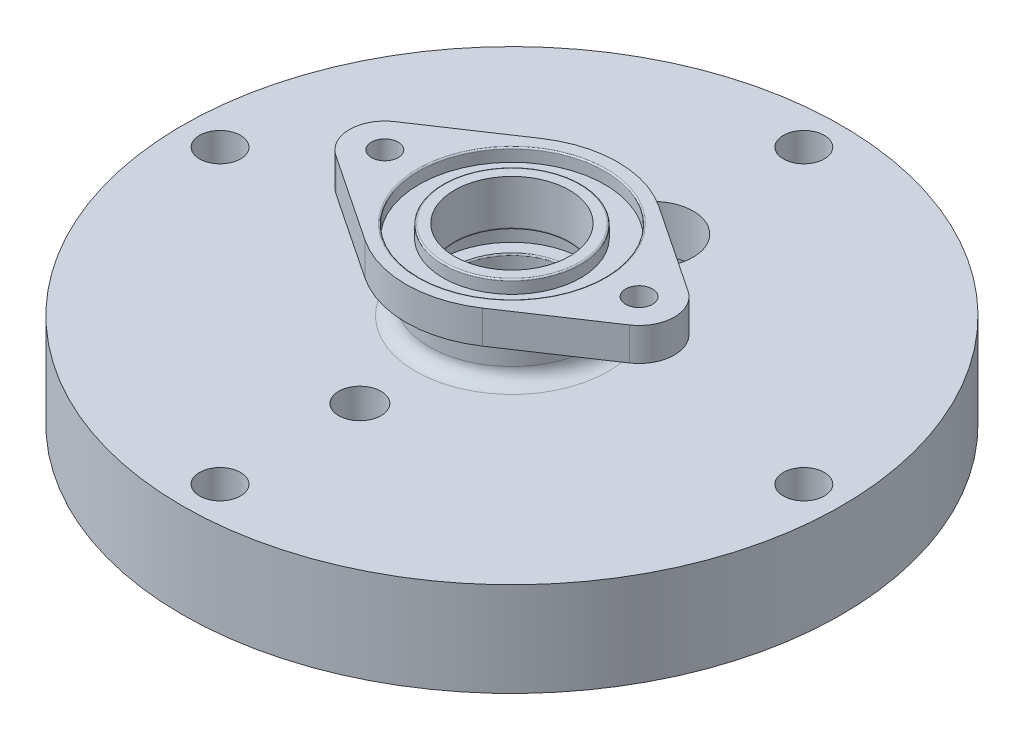
ISO-10303-21;
HEADER;
FILE_DESCRIPTION(('STEP AP214'),'2;1');
FILE_NAME('part.step','',(''),(''),'','','');
FILE_SCHEMA(('AUTOMOTIVE_DESIGN { 1 0 10303 214 1 1 1 1 }'));
ENDSEC;
DATA;
#1=APPLICATION_CONTEXT('core data for automotive mechanical design processes');
#2=APPLICATION_PROTOCOL_DEFINITION('international standard','automotive_design',2000,#1);
#3=PRODUCT_CONTEXT('',#1,'mechanical');
#4=PRODUCT('Part','Part','',(#3));
#5=PRODUCT_RELATED_PRODUCT_CATEGORY('part','',(#4));
#6=PRODUCT_DEFINITION_FORMATION('','',#4);
#7=PRODUCT_DEFINITION_CONTEXT('part definition',#1,'design');
#8=PRODUCT_DEFINITION('design','',#6,#7);
#9=PRODUCT_DEFINITION_SHAPE('','',#8);
#10=(LENGTH_UNIT() NAMED_UNIT(*) SI_UNIT(.MILLI.,.METRE.));
#11=(NAMED_UNIT(*) PLANE_ANGLE_UNIT() SI_UNIT($,.RADIAN.));
#12=(NAMED_UNIT(*) SI_UNIT($,.STERADIAN.) SOLID_ANGLE_UNIT());
#13=UNCERTAINTY_MEASURE_WITH_UNIT(LENGTH_MEASURE(1.E-05),#10,'distance_accuracy_value','');
#14=(GEOMETRIC_REPRESENTATION_CONTEXT(3) GLOBAL_UNCERTAINTY_ASSIGNED_CONTEXT((#13)) GLOBAL_UNIT_ASSIGNED_CONTEXT((#10,
#11,#12)) REPRESENTATION_CONTEXT('',''));
#15=CARTESIAN_POINT('',(0.,0.,0.));
#16=DIRECTION('',(0.,0.,1.));
#17=DIRECTION('',(1.,0.,0.));
#18=AXIS2_PLACEMENT_3D('',#15,#16,#17);
#19=CARTESIAN_POINT('',(0.,0.,0.));
#20=DIRECTION('',(0.,1.,0.));
#21=DIRECTION('',(0.,0.,1.));
#22=AXIS2_PLACEMENT_3D('',#19,#20,#21);
#23=PLANE('',#22);
#24=CARTESIAN_POINT('',(0.,0.,0.));
#25=DIRECTION('',(0.,-1.,0.));
#26=DIRECTION('',(0.,0.,-1.));
#27=AXIS2_PLACEMENT_3D('',#24,#25,#26);
#28=CIRCLE('',#27,41.);
#29=CARTESIAN_POINT('',(0.,0.,-41.));
#30=VERTEX_POINT('',#29);
#31=EDGE_CURVE('E180',#30,#30,#28,.T.);
#32=ORIENTED_EDGE('',*,*,#31,.F.);
#33=EDGE_LOOP('',(#32));
#34=FACE_BOUND('',#33,.T.);
#35=CARTESIAN_POINT('',(0.,0.,0.));
#36=DIRECTION('',(0.,-1.,0.));
#37=DIRECTION('',(0.,0.,-1.));
#38=AXIS2_PLACEMENT_3D('',#35,#36,#37);
#39=CIRCLE('',#38,44.25);
#40=CARTESIAN_POINT('',(0.,0.,-44.25));
#41=VERTEX_POINT('',#40);
#42=EDGE_CURVE('E760',#41,#41,#39,.T.);
#43=ORIENTED_EDGE('',*,*,#42,.T.);
#44=EDGE_LOOP('',(#43));
#45=FACE_BOUND('',#44,.T.);
#46=ADVANCED_FACE('F45',(#34,#45),#23,.F.);
#47=CARTESIAN_POINT('',(0.,0.,0.));
#48=DIRECTION('',(0.,1.,0.));
#49=DIRECTION('',(0.,0.,1.));
#50=AXIS2_PLACEMENT_3D('',#47,#48,#49);
#51=CYLINDRICAL_SURFACE('',#50,12.2);
#52=CARTESIAN_POINT('',(0.,27.5318590738035,0.));
#53=DIRECTION('',(0.,1.,0.));
#54=DIRECTION('',(0.,0.,1.));
#55=AXIS2_PLACEMENT_3D('',#52,#53,#54);
#56=CIRCLE('',#55,12.2);
#57=CARTESIAN_POINT('',(0.,27.5318590738035,12.2));
#58=VERTEX_POINT('',#57);
#59=EDGE_CURVE('E54',#58,#58,#56,.F.);
#60=ORIENTED_EDGE('',*,*,#59,.T.);
#61=EDGE_LOOP('',(#60));
#62=FACE_BOUND('',#61,.T.);
#63=CARTESIAN_POINT('',(0.,37.,0.));
#64=DIRECTION('',(0.,1.,0.));
#65=DIRECTION('',(0.,0.,1.));
#66=AXIS2_PLACEMENT_3D('',#63,#64,#65);
#67=CIRCLE('',#66,12.2);
#68=CARTESIAN_POINT('',(0.,37.,12.2));
#69=VERTEX_POINT('',#68);
#70=EDGE_CURVE('E399',#69,#69,#67,.T.);
#71=ORIENTED_EDGE('',*,*,#70,.T.);
#72=EDGE_LOOP('',(#71));
#73=FACE_BOUND('',#72,.T.);
#74=ADVANCED_FACE('F224',(#62,#73),#51,.F.);
#75=CARTESIAN_POINT('',(-27.,37.,0.));
#76=DIRECTION('',(0.,1.,0.));
#77=DIRECTION('',(0.,0.,1.));
#78=AXIS2_PLACEMENT_3D('',#75,#76,#77);
#79=PLANE('',#78);
#80=CARTESIAN_POINT('',(0.,37.,0.));
#81=DIRECTION('',(0.,1.,0.));
#82=DIRECTION('',(0.,0.,1.));
#83=AXIS2_PLACEMENT_3D('',#80,#81,#82);
#84=CIRCLE('',#83,14.32);
#85=CARTESIAN_POINT('',(0.,37.,14.32));
#86=VERTEX_POINT('',#85);
#87=EDGE_CURVE('E198',#86,#86,#84,.T.);
#88=ORIENTED_EDGE('',*,*,#87,.T.);
#89=EDGE_LOOP('',(#88));
#90=FACE_BOUND('',#89,.T.);
#91=ORIENTED_EDGE('',*,*,#70,.F.);
#92=EDGE_LOOP('',(#91));
#93=FACE_BOUND('',#92,.T.);
#94=ADVANCED_FACE('F246',(#90,#93),#79,.T.);
#95=CARTESIAN_POINT('',(0.,20.,0.));
#96=DIRECTION('',(0.,-1.,0.));
#97=DIRECTION('',(0.,0.,-1.));
#98=AXIS2_PLACEMENT_3D('',#95,#96,#97);
#99=CYLINDRICAL_SURFACE('',#98,70.);
#100=CARTESIAN_POINT('',(0.,20.,0.));
#101=DIRECTION('',(0.,1.,0.));
#102=DIRECTION('',(0.,0.,1.));
#103=AXIS2_PLACEMENT_3D('',#100,#101,#102);
#104=CIRCLE('',#103,70.);
#105=CARTESIAN_POINT('',(0.,20.,70.));
#106=VERTEX_POINT('',#105);
#107=EDGE_CURVE('E187',#106,#106,#104,.T.);
#108=ORIENTED_EDGE('',*,*,#107,.F.);
#109=EDGE_LOOP('',(#108));
#110=FACE_BOUND('',#109,.T.);
#111=CARTESIAN_POINT('',(0.,0.,0.));
#112=DIRECTION('',(0.,1.,0.));
#113=DIRECTION('',(0.,0.,1.));
#114=AXIS2_PLACEMENT_3D('',#111,#112,#113);
#115=CIRCLE('',#114,70.);
#116=CARTESIAN_POINT('',(0.,0.,70.));
#117=VERTEX_POINT('',#116);
#118=EDGE_CURVE('E184',#117,#117,#115,.T.);
#119=ORIENTED_EDGE('',*,*,#118,.T.);
#120=EDGE_LOOP('',(#119));
#121=FACE_BOUND('',#120,.T.);
#122=ADVANCED_FACE('F268',(#110,#121),#99,.T.);
#123=CARTESIAN_POINT('',(0.,20.,0.));
#124=DIRECTION('',(0.,1.,0.));
#125=DIRECTION('',(0.,0.,1.));
#126=AXIS2_PLACEMENT_3D('',#123,#124,#125);
#127=PLANE('',#126);
#128=CARTESIAN_POINT('',(0.,20.,32.2985888887792));
#129=DIRECTION('',(0.,-1.,0.));
#130=DIRECTION('',(0.,0.,-1.));
#131=AXIS2_PLACEMENT_3D('',#128,#129,#130);
#132=CIRCLE('',#131,4.49999999999999);
#133=CARTESIAN_POINT('',(0.,20.,27.7985888887792));
#134=VERTEX_POINT('',#133);
#135=EDGE_CURVE('E369',#134,#134,#132,.T.);
#136=ORIENTED_EDGE('',*,*,#135,.T.);
#137=EDGE_LOOP('',(#136));
#138=FACE_BOUND('',#137,.T.);
#139=CARTESIAN_POINT('',(0.,20.,-30.));
#140=DIRECTION('',(0.,1.,0.));
#141=DIRECTION('',(0.,0.,1.));
#142=AXIS2_PLACEMENT_3D('',#139,#140,#141);
#143=CIRCLE('',#142,8.5);
#144=CARTESIAN_POINT('',(0.,20.,-21.5));
#145=VERTEX_POINT('',#144);
#146=EDGE_CURVE('E364',#145,#145,#143,.T.);
#147=ORIENTED_EDGE('',*,*,#146,.F.);
#148=EDGE_LOOP('',(#147));
#149=FACE_BOUND('',#148,.T.);
#150=CARTESIAN_POINT('',(0.,20.,-62.));
#151=DIRECTION('',(0.,1.,0.));
#152=DIRECTION('',(0.,0.,1.));
#153=AXIS2_PLACEMENT_3D('',#150,#151,#152);
#154=CIRCLE('',#153,4.35);
#155=CARTESIAN_POINT('',(0.,20.,-57.65));
#156=VERTEX_POINT('',#155);
#157=EDGE_CURVE('E376',#156,#156,#154,.T.);
#158=ORIENTED_EDGE('',*,*,#157,.F.);
#159=EDGE_LOOP('',(#158));
#160=FACE_BOUND('',#159,.T.);
#161=CARTESIAN_POINT('',(62.0000000000018,20.,-1.75455317453033E-12));
#162=DIRECTION('',(0.,1.,0.));
#163=DIRECTION('',(0.,0.,1.));
#164=AXIS2_PLACEMENT_3D('',#161,#162,#163);
#165=CIRCLE('',#164,4.34999999999999);
#166=CARTESIAN_POINT('',(62.0000000000018,20.,4.34999999999824));
#167=VERTEX_POINT('',#166);
#168=EDGE_CURVE('E380',#167,#167,#165,.T.);
#169=ORIENTED_EDGE('',*,*,#168,.F.);
#170=EDGE_LOOP('',(#169));
#171=FACE_BOUND('',#170,.T.);
#172=CARTESIAN_POINT('',(3.50910634906067E-12,20.,62.));
#173=DIRECTION('',(0.,1.,0.));
#174=DIRECTION('',(0.,0.,1.));
#175=AXIS2_PLACEMENT_3D('',#172,#173,#174);
#176=CIRCLE('',#175,4.35);
#177=CARTESIAN_POINT('',(3.50910634906067E-12,20.,66.35));
#178=VERTEX_POINT('',#177);
#179=EDGE_CURVE('E384',#178,#178,#176,.T.);
#180=ORIENTED_EDGE('',*,*,#179,.F.);
#181=EDGE_LOOP('',(#180));
#182=FACE_BOUND('',#181,.T.);
#183=CARTESIAN_POINT('',(-61.9999999999983,20.,1.76214598468505E-12));
#184=DIRECTION('',(0.,1.,0.));
#185=DIRECTION('',(0.,0.,1.));
#186=AXIS2_PLACEMENT_3D('',#183,#184,#185);
#187=CIRCLE('',#186,4.35);
#188=CARTESIAN_POINT('',(-61.9999999999983,20.,4.35000000000176));
#189=VERTEX_POINT('',#188);
#190=EDGE_CURVE('E363',#189,#189,#187,.T.);
#191=ORIENTED_EDGE('',*,*,#190,.F.);
#192=EDGE_LOOP('',(#191));
#193=FACE_BOUND('',#192,.T.);
#194=CARTESIAN_POINT('',(0.,20.,0.));
#195=DIRECTION('',(0.,1.,0.));
#196=DIRECTION('',(0.,0.,1.));
#197=AXIS2_PLACEMENT_3D('',#194,#195,#196);
#198=CIRCLE('',#197,20.5);
#199=CARTESIAN_POINT('',(0.,20.,20.5));
#200=VERTEX_POINT('',#199);
#201=EDGE_CURVE('E213',#200,#200,#198,.F.);
#202=ORIENTED_EDGE('',*,*,#201,.T.);
#203=EDGE_LOOP('',(#202));
#204=FACE_BOUND('',#203,.T.);
#205=ORIENTED_EDGE('',*,*,#107,.T.);
#206=EDGE_LOOP('',(#205));
#207=FACE_BOUND('',#206,.T.);
#208=ADVANCED_FACE('F258',(#138,#149,#160,#171,#182,#193,#204,#207),#127,.T.);
#209=CARTESIAN_POINT('',(0.,0.,0.));
#210=DIRECTION('',(0.,-1.,0.));
#211=DIRECTION('',(0.,0.,-1.));
#212=AXIS2_PLACEMENT_3D('',#209,#210,#211);
#213=CIRCLE('',#212,51.);
#214=CARTESIAN_POINT('',(0.,0.,-51.));
#215=VERTEX_POINT('',#214);
#216=EDGE_CURVE('E273',#215,#215,#213,.T.);
#217=ORIENTED_EDGE('',*,*,#216,.F.);
#218=EDGE_LOOP('',(#217));
#219=FACE_BOUND('',#218,.T.);
#220=CARTESIAN_POINT('',(0.,0.,-62.));
#221=DIRECTION('',(0.,1.,0.));
#222=DIRECTION('',(0.,0.,1.));
#223=AXIS2_PLACEMENT_3D('',#220,#221,#222);
#224=CIRCLE('',#223,4.35);
#225=CARTESIAN_POINT('',(0.,0.,-57.65));
#226=VERTEX_POINT('',#225);
#227=EDGE_CURVE('E277',#226,#226,#224,.T.);
#228=ORIENTED_EDGE('',*,*,#227,.T.);
#229=EDGE_LOOP('',(#228));
#230=FACE_BOUND('',#229,.T.);
#231=CARTESIAN_POINT('',(62.0000000000018,0.,-1.75455317453033E-12));
#232=DIRECTION('',(0.,1.,0.));
#233=DIRECTION('',(0.,0.,1.));
#234=AXIS2_PLACEMENT_3D('',#231,#232,#233);
#235=CIRCLE('',#234,4.34999999999999);
#236=CARTESIAN_POINT('',(62.0000000000018,0.,4.34999999999824));
#237=VERTEX_POINT('',#236);
#238=EDGE_CURVE('E281',#237,#237,#235,.T.);
#239=ORIENTED_EDGE('',*,*,#238,.T.);
#240=EDGE_LOOP('',(#239));
#241=FACE_BOUND('',#240,.T.);
#242=CARTESIAN_POINT('',(3.50910634906067E-12,0.,62.));
#243=DIRECTION('',(0.,1.,0.));
#244=DIRECTION('',(0.,0.,1.));
#245=AXIS2_PLACEMENT_3D('',#242,#243,#244);
#246=CIRCLE('',#245,4.35);
#247=CARTESIAN_POINT('',(3.50910634906067E-12,0.,66.35));
#248=VERTEX_POINT('',#247);
#249=EDGE_CURVE('E285',#248,#248,#246,.T.);
#250=ORIENTED_EDGE('',*,*,#249,.T.);
#251=EDGE_LOOP('',(#250));
#252=FACE_BOUND('',#251,.T.);
#253=CARTESIAN_POINT('',(-61.9999999999983,0.,1.76214598468505E-12));
#254=DIRECTION('',(0.,1.,0.));
#255=DIRECTION('',(0.,0.,1.));
#256=AXIS2_PLACEMENT_3D('',#253,#254,#255);
#257=CIRCLE('',#256,4.35);
#258=CARTESIAN_POINT('',(-61.9999999999983,0.,4.35000000000176));
#259=VERTEX_POINT('',#258);
#260=EDGE_CURVE('E289',#259,#259,#257,.T.);
#261=ORIENTED_EDGE('',*,*,#260,.T.);
#262=EDGE_LOOP('',(#261));
#263=FACE_BOUND('',#262,.T.);
#264=ORIENTED_EDGE('',*,*,#118,.F.);
#265=EDGE_LOOP('',(#264));
#266=FACE_BOUND('',#265,.T.);
#267=ADVANCED_FACE('F240',(#219,#230,#241,#252,#263,#266),#23,.F.);
#268=CARTESIAN_POINT('',(0.,10.,0.));
#269=DIRECTION('',(0.,-1.,0.));
#270=DIRECTION('',(0.,0.,-1.));
#271=AXIS2_PLACEMENT_3D('',#268,#269,#270);
#272=CYLINDRICAL_SURFACE('',#271,41.);
#273=CARTESIAN_POINT('',(0.,10.,0.));
#274=DIRECTION('',(0.,-1.,0.));
#275=DIRECTION('',(0.,0.,-1.));
#276=AXIS2_PLACEMENT_3D('',#273,#274,#275);
#277=CIRCLE('',#276,41.);
#278=CARTESIAN_POINT('',(0.,10.,-41.));
#279=VERTEX_POINT('',#278);
#280=EDGE_CURVE('E181',#279,#279,#277,.T.);
#281=ORIENTED_EDGE('',*,*,#280,.F.);
#282=EDGE_LOOP('',(#281));
#283=FACE_BOUND('',#282,.T.);
#284=ORIENTED_EDGE('',*,*,#31,.T.);
#285=EDGE_LOOP('',(#284));
#286=FACE_BOUND('',#285,.T.);
#287=ADVANCED_FACE('F257',(#283,#286),#272,.F.);
#288=CARTESIAN_POINT('',(0.,10.,0.));
#289=DIRECTION('',(0.,-1.,0.));
#290=DIRECTION('',(0.,0.,-1.));
#291=AXIS2_PLACEMENT_3D('',#288,#289,#290);
#292=PLANE('',#291);
#293=CARTESIAN_POINT('',(0.,10.,32.2985888887792));
#294=DIRECTION('',(0.,-1.,0.));
#295=DIRECTION('',(0.,0.,-1.));
#296=AXIS2_PLACEMENT_3D('',#293,#294,#295);
#297=CIRCLE('',#296,4.49999999999999);
#298=CARTESIAN_POINT('',(0.,10.,27.7985888887792));
#299=VERTEX_POINT('',#298);
#300=EDGE_CURVE('E352',#299,#299,#297,.T.);
#301=ORIENTED_EDGE('',*,*,#300,.F.);
#302=EDGE_LOOP('',(#301));
#303=FACE_BOUND('',#302,.T.);
#304=CARTESIAN_POINT('',(0.,10.,-30.));
#305=DIRECTION('',(0.,1.,0.));
#306=DIRECTION('',(0.,0.,1.));
#307=AXIS2_PLACEMENT_3D('',#304,#305,#306);
#308=CIRCLE('',#307,8.5);
#309=CARTESIAN_POINT('',(0.,10.,-21.5));
#310=VERTEX_POINT('',#309);
#311=EDGE_CURVE('E356',#310,#310,#308,.T.);
#312=ORIENTED_EDGE('',*,*,#311,.T.);
#313=EDGE_LOOP('',(#312));
#314=FACE_BOUND('',#313,.T.);
#315=CARTESIAN_POINT('',(0.,10.,0.));
#316=DIRECTION('',(0.,-1.,0.));
#317=DIRECTION('',(0.,0.,-1.));
#318=AXIS2_PLACEMENT_3D('',#315,#316,#317);
#319=CIRCLE('',#318,17.35);
#320=CARTESIAN_POINT('',(0.,10.,-17.35));
#321=VERTEX_POINT('',#320);
#322=EDGE_CURVE('E174',#321,#321,#319,.T.);
#323=ORIENTED_EDGE('',*,*,#322,.F.);
#324=EDGE_LOOP('',(#323));
#325=FACE_BOUND('',#324,.T.);
#326=ORIENTED_EDGE('',*,*,#280,.T.);
#327=EDGE_LOOP('',(#326));
#328=FACE_BOUND('',#327,.T.);
#329=ADVANCED_FACE('F264',(#303,#314,#325,#328),#292,.T.);
#330=CARTESIAN_POINT('',(0.,10.,0.));
#331=DIRECTION('',(0.,1.,0.));
#332=DIRECTION('',(0.,0.,1.));
#333=AXIS2_PLACEMENT_3D('',#330,#331,#332);
#334=CONICAL_SURFACE('',#333,17.35,0.358770670270572);
#335=CARTESIAN_POINT('',(0.,0.,0.));
#336=DIRECTION('',(0.,-1.,0.));
#337=DIRECTION('',(0.,0.,-1.));
#338=AXIS2_PLACEMENT_3D('',#335,#336,#337);
#339=CIRCLE('',#338,13.6);
#340=CARTESIAN_POINT('',(0.,0.,-13.6));
#341=VERTEX_POINT('',#340);
#342=EDGE_CURVE('E177',#341,#341,#339,.T.);
#343=ORIENTED_EDGE('',*,*,#342,.F.);
#344=EDGE_LOOP('',(#343));
#345=FACE_BOUND('',#344,.T.);
#346=ORIENTED_EDGE('',*,*,#322,.T.);
#347=EDGE_LOOP('',(#346));
#348=FACE_BOUND('',#347,.T.);
#349=ADVANCED_FACE('F255',(#345,#348),#334,.T.);
#350=CARTESIAN_POINT('',(0.,0.,0.));
#351=DIRECTION('',(0.,1.,0.));
#352=DIRECTION('',(0.,0.,1.));
#353=AXIS2_PLACEMENT_3D('',#350,#351,#352);
#354=CIRCLE('',#353,12.2);
#355=CARTESIAN_POINT('',(0.,0.,12.2));
#356=VERTEX_POINT('',#355);
#357=EDGE_CURVE('E400',#356,#356,#354,.T.);
#358=ORIENTED_EDGE('',*,*,#357,.T.);
#359=EDGE_LOOP('',(#358));
#360=FACE_BOUND('',#359,.T.);
#361=ORIENTED_EDGE('',*,*,#342,.T.);
#362=EDGE_LOOP('',(#361));
#363=FACE_BOUND('',#362,.T.);
#364=ADVANCED_FACE('F239',(#360,#363),#23,.F.);
#365=CARTESIAN_POINT('',(0.,30.,0.));
#366=DIRECTION('',(0.,-1.,0.));
#367=DIRECTION('',(0.,0.,-1.));
#368=AXIS2_PLACEMENT_3D('',#365,#366,#367);
#369=CYLINDRICAL_SURFACE('',#368,17.5);
#370=CARTESIAN_POINT('',(0.,27.,0.));
#371=DIRECTION('',(0.,1.,0.));
#372=DIRECTION('',(0.,0.,1.));
#373=AXIS2_PLACEMENT_3D('',#370,#371,#372);
#374=CIRCLE('',#373,17.5);
#375=CARTESIAN_POINT('',(0.,27.,17.5));
#376=VERTEX_POINT('',#375);
#377=EDGE_CURVE('E210',#376,#376,#374,.F.);
#378=ORIENTED_EDGE('',*,*,#377,.T.);
#379=EDGE_LOOP('',(#378));
#380=FACE_BOUND('',#379,.T.);
#381=CARTESIAN_POINT('',(0.,23.,0.));
#382=DIRECTION('',(0.,1.,0.));
#383=DIRECTION('',(0.,0.,1.));
#384=AXIS2_PLACEMENT_3D('',#381,#382,#383);
#385=CIRCLE('',#384,17.5);
#386=CARTESIAN_POINT('',(0.,23.,17.5));
#387=VERTEX_POINT('',#386);
#388=EDGE_CURVE('E207',#387,#387,#385,.T.);
#389=ORIENTED_EDGE('',*,*,#388,.T.);
#390=EDGE_LOOP('',(#389));
#391=FACE_BOUND('',#390,.T.);
#392=ADVANCED_FACE('F254',(#380,#391),#369,.T.);
#393=CARTESIAN_POINT('',(0.,37.,0.));
#394=DIRECTION('',(0.,1.,0.));
#395=DIRECTION('',(0.,0.,1.));
#396=AXIS2_PLACEMENT_3D('',#393,#394,#395);
#397=CIRCLE('',#396,20.05);
#398=CARTESIAN_POINT('',(0.,37.,20.05));
#399=VERTEX_POINT('',#398);
#400=EDGE_CURVE('E195',#399,#399,#397,.F.);
#401=ORIENTED_EDGE('',*,*,#400,.T.);
#402=EDGE_LOOP('',(#401));
#403=FACE_BOUND('',#402,.T.);
#404=CARTESIAN_POINT('',(-27.,37.,0.));
#405=DIRECTION('',(0.,1.,0.));
#406=DIRECTION('',(0.,0.,1.));
#407=AXIS2_PLACEMENT_3D('',#404,#405,#406);
#408=CIRCLE('',#407,2.85);
#409=CARTESIAN_POINT('',(-27.,37.,2.85000000000001));
#410=VERTEX_POINT('',#409);
#411=EDGE_CURVE('E148',#410,#410,#408,.T.);
#412=ORIENTED_EDGE('',*,*,#411,.F.);
#413=EDGE_LOOP('',(#412));
#414=FACE_BOUND('',#413,.T.);
#415=CARTESIAN_POINT('',(-27.,37.,0.));
#416=DIRECTION('',(0.,1.,0.));
#417=DIRECTION('',(0.,0.,1.));
#418=AXIS2_PLACEMENT_3D('',#415,#416,#417);
#419=CIRCLE('',#418,7.5);
#420=CARTESIAN_POINT('',(-31.1666666666667,37.,-6.23609564462323));
#421=VERTEX_POINT('',#420);
#422=CARTESIAN_POINT('',(-31.1666666666667,37.,6.23609564462324));
#423=VERTEX_POINT('',#422);
#424=EDGE_CURVE('E159',#421,#423,#419,.T.);
#425=ORIENTED_EDGE('',*,*,#424,.T.);
#426=DIRECTION('',(0.831479419283098,0.,0.555555555555556));
#427=VECTOR('',#426,1.);
#428=CARTESIAN_POINT('',(-12.5,37.,18.7082869338697));
#429=LINE('',#428,#427);
#430=CARTESIAN_POINT('',(-12.5,37.,18.7082869338697));
#431=VERTEX_POINT('',#430);
#432=EDGE_CURVE('E106',#423,#431,#429,.T.);
#433=ORIENTED_EDGE('',*,*,#432,.T.);
#434=CARTESIAN_POINT('',(0.,37.,0.));
#435=DIRECTION('',(0.,1.,0.));
#436=DIRECTION('',(0.,0.,1.));
#437=AXIS2_PLACEMENT_3D('',#434,#435,#436);
#438=CIRCLE('',#437,22.5);
#439=CARTESIAN_POINT('',(12.5,37.,18.7082869338697));
#440=VERTEX_POINT('',#439);
#441=EDGE_CURVE('E418',#431,#440,#438,.T.);
#442=ORIENTED_EDGE('',*,*,#441,.T.);
#443=DIRECTION('',(0.831479419283098,0.,-0.555555555555555));
#444=VECTOR('',#443,1.);
#445=CARTESIAN_POINT('',(31.1666666666667,37.,6.23609564462324));
#446=LINE('',#445,#444);
#447=CARTESIAN_POINT('',(31.1666666666667,37.,6.23609564462324));
#448=VERTEX_POINT('',#447);
#449=EDGE_CURVE('E420',#440,#448,#446,.T.);
#450=ORIENTED_EDGE('',*,*,#449,.T.);
#451=CARTESIAN_POINT('',(27.,37.,0.));
#452=DIRECTION('',(0.,1.,0.));
#453=DIRECTION('',(0.,0.,1.));
#454=AXIS2_PLACEMENT_3D('',#451,#452,#453);
#455=CIRCLE('',#454,7.5);
#456=CARTESIAN_POINT('',(31.1666666666667,37.,-6.23609564462323));
#457=VERTEX_POINT('',#456);
#458=EDGE_CURVE('E126',#448,#457,#455,.T.);
#459=ORIENTED_EDGE('',*,*,#458,.T.);
#460=DIRECTION('',(-0.831479419283098,0.,-0.555555555555555));
#461=VECTOR('',#460,1.);
#462=CARTESIAN_POINT('',(31.1666666666667,37.,-6.23609564462323));
#463=LINE('',#462,#461);
#464=CARTESIAN_POINT('',(12.5,37.,-18.7082869338697));
#465=VERTEX_POINT('',#464);
#466=EDGE_CURVE('E119',#457,#465,#463,.T.);
#467=ORIENTED_EDGE('',*,*,#466,.T.);
#468=CARTESIAN_POINT('',(0.,37.,0.));
#469=DIRECTION('',(0.,1.,0.));
#470=DIRECTION('',(0.,0.,1.));
#471=AXIS2_PLACEMENT_3D('',#468,#469,#470);
#472=CIRCLE('',#471,22.5);
#473=CARTESIAN_POINT('',(-12.5,37.,-18.7082869338697));
#474=VERTEX_POINT('',#473);
#475=EDGE_CURVE('E124',#465,#474,#472,.T.);
#476=ORIENTED_EDGE('',*,*,#475,.T.);
#477=DIRECTION('',(-0.831479419283098,0.,0.555555555555556));
#478=VECTOR('',#477,1.);
#479=CARTESIAN_POINT('',(-12.5,37.,-18.7082869338697));
#480=LINE('',#479,#478);
#481=EDGE_CURVE('E62',#474,#421,#480,.T.);
#482=ORIENTED_EDGE('',*,*,#481,.T.);
#483=EDGE_LOOP('',(#425,#433,#442,#450,#459,#467,#476,#482));
#484=FACE_BOUND('',#483,.T.);
#485=CARTESIAN_POINT('',(27.,37.,0.));
#486=DIRECTION('',(0.,1.,0.));
#487=DIRECTION('',(0.,0.,1.));
#488=AXIS2_PLACEMENT_3D('',#485,#486,#487);
#489=CIRCLE('',#488,2.85);
#490=CARTESIAN_POINT('',(27.,37.,2.85));
#491=VERTEX_POINT('',#490);
#492=EDGE_CURVE('E406',#491,#491,#489,.T.);
#493=ORIENTED_EDGE('',*,*,#492,.F.);
#494=EDGE_LOOP('',(#493));
#495=FACE_BOUND('',#494,.T.);
#496=ADVANCED_FACE('F121',(#403,#414,#484,#495),#79,.T.);
#497=CARTESIAN_POINT('',(-27.,30.,0.));
#498=DIRECTION('',(0.,1.,0.));
#499=DIRECTION('',(0.,0.,1.));
#500=AXIS2_PLACEMENT_3D('',#497,#498,#499);
#501=PLANE('',#500);
#502=CARTESIAN_POINT('',(0.,30.,0.));
#503=DIRECTION('',(0.,1.,0.));
#504=DIRECTION('',(0.,0.,1.));
#505=AXIS2_PLACEMENT_3D('',#502,#503,#504);
#506=CIRCLE('',#505,20.5);
#507=CARTESIAN_POINT('',(0.,30.,20.5));
#508=VERTEX_POINT('',#507);
#509=EDGE_CURVE('E204',#508,#508,#506,.T.);
#510=ORIENTED_EDGE('',*,*,#509,.T.);
#511=EDGE_LOOP('',(#510));
#512=FACE_BOUND('',#511,.T.);
#513=CARTESIAN_POINT('',(-27.,30.,0.));
#514=DIRECTION('',(0.,1.,0.));
#515=DIRECTION('',(0.,0.,1.));
#516=AXIS2_PLACEMENT_3D('',#513,#514,#515);
#517=CIRCLE('',#516,7.5);
#518=CARTESIAN_POINT('',(-31.1666666666667,30.,-6.23609564462323));
#519=VERTEX_POINT('',#518);
#520=CARTESIAN_POINT('',(-31.1666666666667,30.,6.23609564462324));
#521=VERTEX_POINT('',#520);
#522=EDGE_CURVE('E144',#519,#521,#517,.T.);
#523=ORIENTED_EDGE('',*,*,#522,.F.);
#524=DIRECTION('',(-0.831479419283098,0.,0.555555555555556));
#525=VECTOR('',#524,1.);
#526=CARTESIAN_POINT('',(-12.5,30.,-18.7082869338697));
#527=LINE('',#526,#525);
#528=CARTESIAN_POINT('',(-12.5,30.,-18.7082869338697));
#529=VERTEX_POINT('',#528);
#530=EDGE_CURVE('E97',#529,#519,#527,.T.);
#531=ORIENTED_EDGE('',*,*,#530,.F.);
#532=CARTESIAN_POINT('',(0.,30.,0.));
#533=DIRECTION('',(0.,1.,0.));
#534=DIRECTION('',(0.,0.,1.));
#535=AXIS2_PLACEMENT_3D('',#532,#533,#534);
#536=CIRCLE('',#535,22.5);
#537=CARTESIAN_POINT('',(12.5,30.,-18.7082869338697));
#538=VERTEX_POINT('',#537);
#539=EDGE_CURVE('E91',#538,#529,#536,.T.);
#540=ORIENTED_EDGE('',*,*,#539,.F.);
#541=DIRECTION('',(-0.831479419283098,0.,-0.555555555555555));
#542=VECTOR('',#541,1.);
#543=CARTESIAN_POINT('',(31.1666666666667,30.,-6.23609564462323));
#544=LINE('',#543,#542);
#545=CARTESIAN_POINT('',(31.1666666666667,30.,-6.23609564462323));
#546=VERTEX_POINT('',#545);
#547=EDGE_CURVE('E134',#546,#538,#544,.T.);
#548=ORIENTED_EDGE('',*,*,#547,.F.);
#549=CARTESIAN_POINT('',(27.,30.,0.));
#550=DIRECTION('',(0.,1.,0.));
#551=DIRECTION('',(0.,0.,1.));
#552=AXIS2_PLACEMENT_3D('',#549,#550,#551);
#553=CIRCLE('',#552,7.5);
#554=CARTESIAN_POINT('',(31.1666666666667,30.,6.23609564462324));
#555=VERTEX_POINT('',#554);
#556=EDGE_CURVE('E154',#555,#546,#553,.T.);
#557=ORIENTED_EDGE('',*,*,#556,.F.);
#558=DIRECTION('',(0.831479419283098,0.,-0.555555555555555));
#559=VECTOR('',#558,1.);
#560=CARTESIAN_POINT('',(31.1666666666667,30.,6.23609564462324));
#561=LINE('',#560,#559);
#562=CARTESIAN_POINT('',(12.5,30.,18.7082869338697));
#563=VERTEX_POINT('',#562);
#564=EDGE_CURVE('E152',#563,#555,#561,.T.);
#565=ORIENTED_EDGE('',*,*,#564,.F.);
#566=CARTESIAN_POINT('',(0.,30.,0.));
#567=DIRECTION('',(0.,1.,0.));
#568=DIRECTION('',(0.,0.,1.));
#569=AXIS2_PLACEMENT_3D('',#566,#567,#568);
#570=CIRCLE('',#569,22.5);
#571=CARTESIAN_POINT('',(-12.5,30.,18.7082869338697));
#572=VERTEX_POINT('',#571);
#573=EDGE_CURVE('E150',#572,#563,#570,.T.);
#574=ORIENTED_EDGE('',*,*,#573,.F.);
#575=DIRECTION('',(0.831479419283098,0.,0.555555555555556));
#576=VECTOR('',#575,1.);
#577=CARTESIAN_POINT('',(-12.5,30.,18.7082869338697));
#578=LINE('',#577,#576);
#579=EDGE_CURVE('E147',#521,#572,#578,.T.);
#580=ORIENTED_EDGE('',*,*,#579,.F.);
#581=EDGE_LOOP('',(#523,#531,#540,#548,#557,#565,#574,#580));
#582=FACE_BOUND('',#581,.T.);
#583=CARTESIAN_POINT('',(-27.,30.,0.));
#584=DIRECTION('',(0.,1.,0.));
#585=DIRECTION('',(0.,0.,1.));
#586=AXIS2_PLACEMENT_3D('',#583,#584,#585);
#587=CIRCLE('',#586,2.85);
#588=CARTESIAN_POINT('',(-27.,30.,2.85000000000001));
#589=VERTEX_POINT('',#588);
#590=EDGE_CURVE('E409',#589,#589,#587,.T.);
#591=ORIENTED_EDGE('',*,*,#590,.T.);
#592=EDGE_LOOP('',(#591));
#593=FACE_BOUND('',#592,.T.);
#594=CARTESIAN_POINT('',(27.,30.,0.));
#595=DIRECTION('',(0.,1.,0.));
#596=DIRECTION('',(0.,0.,1.));
#597=AXIS2_PLACEMENT_3D('',#594,#595,#596);
#598=CIRCLE('',#597,2.85);
#599=CARTESIAN_POINT('',(27.,30.,2.85));
#600=VERTEX_POINT('',#599);
#601=EDGE_CURVE('E403',#600,#600,#598,.T.);
#602=ORIENTED_EDGE('',*,*,#601,.T.);
#603=EDGE_LOOP('',(#602));
#604=FACE_BOUND('',#603,.T.);
#605=ADVANCED_FACE('F336',(#512,#582,#593,#604),#501,.F.);
#606=CARTESIAN_POINT('',(-27.,37.,0.));
#607=DIRECTION('',(0.,-1.,0.));
#608=DIRECTION('',(0.,0.,-1.));
#609=AXIS2_PLACEMENT_3D('',#606,#607,#608);
#610=CYLINDRICAL_SURFACE('',#609,7.5);
#611=ORIENTED_EDGE('',*,*,#522,.T.);
#612=DIRECTION('',(0.,-1.,0.));
#613=VECTOR('',#612,1.);
#614=CARTESIAN_POINT('',(-31.1666666666667,37.,6.23609564462324));
#615=LINE('',#614,#613);
#616=EDGE_CURVE('E172',#423,#521,#615,.T.);
#617=ORIENTED_EDGE('',*,*,#616,.F.);
#618=ORIENTED_EDGE('',*,*,#424,.F.);
#619=DIRECTION('',(0.,-1.,0.));
#620=VECTOR('',#619,1.);
#621=CARTESIAN_POINT('',(-31.1666666666667,37.,-6.23609564462323));
#622=LINE('',#621,#620);
#623=EDGE_CURVE('E140',#421,#519,#622,.T.);
#624=ORIENTED_EDGE('',*,*,#623,.T.);
#625=EDGE_LOOP('',(#611,#617,#618,#624));
#626=FACE_BOUND('',#625,.T.);
#627=ADVANCED_FACE('F340',(#626),#610,.T.);
#628=CARTESIAN_POINT('',(-12.5,37.,18.7082869338697));
#629=DIRECTION('',(0.555555555555556,0.,-0.831479419283098));
#630=DIRECTION('',(-0.831479419283098,0.,-0.555555555555556));
#631=AXIS2_PLACEMENT_3D('',#628,#629,#630);
#632=PLANE('',#631);
#633=ORIENTED_EDGE('',*,*,#579,.T.);
#634=DIRECTION('',(0.,-1.,0.));
#635=VECTOR('',#634,1.);
#636=CARTESIAN_POINT('',(-12.5,37.,18.7082869338697));
#637=LINE('',#636,#635);
#638=EDGE_CURVE('E169',#431,#572,#637,.T.);
#639=ORIENTED_EDGE('',*,*,#638,.F.);
#640=ORIENTED_EDGE('',*,*,#432,.F.);
#641=ORIENTED_EDGE('',*,*,#616,.T.);
#642=EDGE_LOOP('',(#633,#639,#640,#641));
#643=FACE_BOUND('',#642,.T.);
#644=ADVANCED_FACE('F460',(#643),#632,.F.);
#645=CARTESIAN_POINT('',(0.,37.,0.));
#646=DIRECTION('',(0.,-1.,0.));
#647=DIRECTION('',(0.,0.,-1.));
#648=AXIS2_PLACEMENT_3D('',#645,#646,#647);
#649=CYLINDRICAL_SURFACE('',#648,22.5);
#650=ORIENTED_EDGE('',*,*,#573,.T.);
#651=DIRECTION('',(0.,-1.,0.));
#652=VECTOR('',#651,1.);
#653=CARTESIAN_POINT('',(12.5,37.,18.7082869338697));
#654=LINE('',#653,#652);
#655=EDGE_CURVE('E166',#440,#563,#654,.T.);
#656=ORIENTED_EDGE('',*,*,#655,.F.);
#657=ORIENTED_EDGE('',*,*,#441,.F.);
#658=ORIENTED_EDGE('',*,*,#638,.T.);
#659=EDGE_LOOP('',(#650,#656,#657,#658));
#660=FACE_BOUND('',#659,.T.);
#661=ADVANCED_FACE('F458',(#660),#649,.T.);
#662=CARTESIAN_POINT('',(31.1666666666667,37.,6.23609564462324));
#663=DIRECTION('',(-0.555555555555555,0.,-0.831479419283098));
#664=DIRECTION('',(-0.831479419283098,0.,0.555555555555555));
#665=AXIS2_PLACEMENT_3D('',#662,#663,#664);
#666=PLANE('',#665);
#667=ORIENTED_EDGE('',*,*,#564,.T.);
#668=DIRECTION('',(0.,-1.,0.));
#669=VECTOR('',#668,1.);
#670=CARTESIAN_POINT('',(31.1666666666667,37.,6.23609564462324));
#671=LINE('',#670,#669);
#672=EDGE_CURVE('E163',#448,#555,#671,.T.);
#673=ORIENTED_EDGE('',*,*,#672,.F.);
#674=ORIENTED_EDGE('',*,*,#449,.F.);
#675=ORIENTED_EDGE('',*,*,#655,.T.);
#676=EDGE_LOOP('',(#667,#673,#674,#675));
#677=FACE_BOUND('',#676,.T.);
#678=ADVANCED_FACE('F426',(#677),#666,.F.);
#679=CARTESIAN_POINT('',(27.,37.,0.));
#680=DIRECTION('',(0.,-1.,0.));
#681=DIRECTION('',(0.,0.,-1.));
#682=AXIS2_PLACEMENT_3D('',#679,#680,#681);
#683=CYLINDRICAL_SURFACE('',#682,7.5);
#684=ORIENTED_EDGE('',*,*,#556,.T.);
#685=DIRECTION('',(0.,-1.,0.));
#686=VECTOR('',#685,1.);
#687=CARTESIAN_POINT('',(31.1666666666667,37.,-6.23609564462323));
#688=LINE('',#687,#686);
#689=EDGE_CURVE('E135',#457,#546,#688,.T.);
#690=ORIENTED_EDGE('',*,*,#689,.F.);
#691=ORIENTED_EDGE('',*,*,#458,.F.);
#692=ORIENTED_EDGE('',*,*,#672,.T.);
#693=EDGE_LOOP('',(#684,#690,#691,#692));
#694=FACE_BOUND('',#693,.T.);
#695=ADVANCED_FACE('F430',(#694),#683,.T.);
#696=CARTESIAN_POINT('',(31.1666666666667,37.,-6.23609564462323));
#697=DIRECTION('',(-0.555555555555555,0.,0.831479419283098));
#698=DIRECTION('',(0.831479419283098,0.,0.555555555555555));
#699=AXIS2_PLACEMENT_3D('',#696,#697,#698);
#700=PLANE('',#699);
#701=ORIENTED_EDGE('',*,*,#547,.T.);
#702=DIRECTION('',(0.,-1.,0.));
#703=VECTOR('',#702,1.);
#704=CARTESIAN_POINT('',(12.5,37.,-18.7082869338697));
#705=LINE('',#704,#703);
#706=EDGE_CURVE('E131',#465,#538,#705,.T.);
#707=ORIENTED_EDGE('',*,*,#706,.F.);
#708=ORIENTED_EDGE('',*,*,#466,.F.);
#709=ORIENTED_EDGE('',*,*,#689,.T.);
#710=EDGE_LOOP('',(#701,#707,#708,#709));
#711=FACE_BOUND('',#710,.T.);
#712=ADVANCED_FACE('F132',(#711),#700,.F.);
#713=CARTESIAN_POINT('',(0.,37.,0.));
#714=DIRECTION('',(0.,-1.,0.));
#715=DIRECTION('',(0.,0.,-1.));
#716=AXIS2_PLACEMENT_3D('',#713,#714,#715);
#717=CYLINDRICAL_SURFACE('',#716,22.5);
#718=ORIENTED_EDGE('',*,*,#539,.T.);
#719=DIRECTION('',(0.,-1.,0.));
#720=VECTOR('',#719,1.);
#721=CARTESIAN_POINT('',(-12.5,37.,-18.7082869338697));
#722=LINE('',#721,#720);
#723=EDGE_CURVE('E136',#474,#529,#722,.T.);
#724=ORIENTED_EDGE('',*,*,#723,.F.);
#725=ORIENTED_EDGE('',*,*,#475,.F.);
#726=ORIENTED_EDGE('',*,*,#706,.T.);
#727=EDGE_LOOP('',(#718,#724,#725,#726));
#728=FACE_BOUND('',#727,.T.);
#729=ADVANCED_FACE('F138',(#728),#717,.T.);
#730=CARTESIAN_POINT('',(-12.5,37.,-18.7082869338697));
#731=DIRECTION('',(0.555555555555556,0.,0.831479419283098));
#732=DIRECTION('',(0.831479419283098,0.,-0.555555555555556));
#733=AXIS2_PLACEMENT_3D('',#730,#731,#732);
#734=PLANE('',#733);
#735=ORIENTED_EDGE('',*,*,#530,.T.);
#736=ORIENTED_EDGE('',*,*,#623,.F.);
#737=ORIENTED_EDGE('',*,*,#481,.F.);
#738=ORIENTED_EDGE('',*,*,#723,.T.);
#739=EDGE_LOOP('',(#735,#736,#737,#738));
#740=FACE_BOUND('',#739,.T.);
#741=ADVANCED_FACE('F438',(#740),#734,.F.);
#742=CARTESIAN_POINT('',(-27.,37.,0.));
#743=DIRECTION('',(0.,-1.,0.));
#744=DIRECTION('',(0.,0.,-1.));
#745=AXIS2_PLACEMENT_3D('',#742,#743,#744);
#746=CYLINDRICAL_SURFACE('',#745,2.85);
#747=ORIENTED_EDGE('',*,*,#411,.T.);
#748=EDGE_LOOP('',(#747));
#749=FACE_BOUND('',#748,.T.);
#750=ORIENTED_EDGE('',*,*,#590,.F.);
#751=EDGE_LOOP('',(#750));
#752=FACE_BOUND('',#751,.T.);
#753=ADVANCED_FACE('F440',(#749,#752),#746,.F.);
#754=CARTESIAN_POINT('',(27.,37.,0.));
#755=DIRECTION('',(0.,-1.,0.));
#756=DIRECTION('',(0.,0.,-1.));
#757=AXIS2_PLACEMENT_3D('',#754,#755,#756);
#758=CYLINDRICAL_SURFACE('',#757,2.85);
#759=ORIENTED_EDGE('',*,*,#492,.T.);
#760=EDGE_LOOP('',(#759));
#761=FACE_BOUND('',#760,.T.);
#762=ORIENTED_EDGE('',*,*,#601,.F.);
#763=EDGE_LOOP('',(#762));
#764=FACE_BOUND('',#763,.T.);
#765=ADVANCED_FACE('F446',(#761,#764),#758,.F.);
#766=CARTESIAN_POINT('',(0.,22.4318590738035,0.));
#767=DIRECTION('',(0.,-1.,0.));
#768=DIRECTION('',(0.,0.,-1.));
#769=AXIS2_PLACEMENT_3D('',#766,#767,#768);
#770=CIRCLE('',#769,12.2);
#771=CARTESIAN_POINT('',(0.,22.4318590738035,-12.2));
#772=VERTEX_POINT('',#771);
#773=EDGE_CURVE('E216',#772,#772,#770,.F.);
#774=ORIENTED_EDGE('',*,*,#773,.T.);
#775=EDGE_LOOP('',(#774));
#776=FACE_BOUND('',#775,.T.);
#777=ORIENTED_EDGE('',*,*,#357,.F.);
#778=EDGE_LOOP('',(#777));
#779=FACE_BOUND('',#778,.T.);
#780=ADVANCED_FACE('F248',(#776,#779),#51,.F.);
#781=CARTESIAN_POINT('',(0.,34.25,0.));
#782=DIRECTION('',(0.,1.,0.));
#783=DIRECTION('',(0.,0.,1.));
#784=AXIS2_PLACEMENT_3D('',#781,#782,#783);
#785=CYLINDRICAL_SURFACE('',#784,19.75);
#786=CARTESIAN_POINT('',(0.,36.7,0.));
#787=DIRECTION('',(0.,1.,0.));
#788=DIRECTION('',(0.,0.,1.));
#789=AXIS2_PLACEMENT_3D('',#786,#787,#788);
#790=CIRCLE('',#789,19.75);
#791=CARTESIAN_POINT('',(0.,36.7,19.75));
#792=VERTEX_POINT('',#791);
#793=EDGE_CURVE('E190',#792,#792,#790,.T.);
#794=ORIENTED_EDGE('',*,*,#793,.T.);
#795=EDGE_LOOP('',(#794));
#796=FACE_BOUND('',#795,.T.);
#797=CARTESIAN_POINT('',(0.,34.25,0.));
#798=DIRECTION('',(0.,1.,0.));
#799=DIRECTION('',(0.,0.,1.));
#800=AXIS2_PLACEMENT_3D('',#797,#798,#799);
#801=CIRCLE('',#800,19.75);
#802=CARTESIAN_POINT('',(0.,34.25,19.75));
#803=VERTEX_POINT('',#802);
#804=EDGE_CURVE('E396',#803,#803,#801,.T.);
#805=ORIENTED_EDGE('',*,*,#804,.F.);
#806=EDGE_LOOP('',(#805));
#807=FACE_BOUND('',#806,.T.);
#808=ADVANCED_FACE('F615',(#796,#807),#785,.F.);
#809=CARTESIAN_POINT('',(0.,34.25,0.));
#810=DIRECTION('',(0.,1.,0.));
#811=DIRECTION('',(0.,0.,1.));
#812=AXIS2_PLACEMENT_3D('',#809,#810,#811);
#813=PLANE('',#812);
#814=CARTESIAN_POINT('',(0.,34.25,0.));
#815=DIRECTION('',(0.,1.,0.));
#816=DIRECTION('',(0.,0.,1.));
#817=AXIS2_PLACEMENT_3D('',#814,#815,#816);
#818=CIRCLE('',#817,14.62);
#819=CARTESIAN_POINT('',(0.,34.25,14.62));
#820=VERTEX_POINT('',#819);
#821=EDGE_CURVE('E393',#820,#820,#818,.T.);
#822=ORIENTED_EDGE('',*,*,#821,.F.);
#823=EDGE_LOOP('',(#822));
#824=FACE_BOUND('',#823,.T.);
#825=ORIENTED_EDGE('',*,*,#804,.T.);
#826=EDGE_LOOP('',(#825));
#827=FACE_BOUND('',#826,.T.);
#828=ADVANCED_FACE('F637',(#824,#827),#813,.T.);
#829=CARTESIAN_POINT('',(0.,34.25,0.));
#830=DIRECTION('',(0.,1.,0.));
#831=DIRECTION('',(0.,0.,1.));
#832=AXIS2_PLACEMENT_3D('',#829,#830,#831);
#833=CYLINDRICAL_SURFACE('',#832,14.62);
#834=CARTESIAN_POINT('',(0.,36.7,0.));
#835=DIRECTION('',(0.,1.,0.));
#836=DIRECTION('',(0.,0.,1.));
#837=AXIS2_PLACEMENT_3D('',#834,#835,#836);
#838=CIRCLE('',#837,14.62);
#839=CARTESIAN_POINT('',(0.,36.7,14.62));
#840=VERTEX_POINT('',#839);
#841=EDGE_CURVE('E201',#840,#840,#838,.F.);
#842=ORIENTED_EDGE('',*,*,#841,.T.);
#843=EDGE_LOOP('',(#842));
#844=FACE_BOUND('',#843,.T.);
#845=ORIENTED_EDGE('',*,*,#821,.T.);
#846=EDGE_LOOP('',(#845));
#847=FACE_BOUND('',#846,.T.);
#848=ADVANCED_FACE('F305',(#844,#847),#833,.T.);
#849=CARTESIAN_POINT('',(0.,36.7,0.));
#850=DIRECTION('',(0.,1.,0.));
#851=DIRECTION('',(0.,0.,1.));
#852=AXIS2_PLACEMENT_3D('',#849,#850,#851);
#853=TOROIDAL_SURFACE('',#852,20.05,0.3);
#854=ORIENTED_EDGE('',*,*,#400,.F.);
#855=EDGE_LOOP('',(#854));
#856=FACE_BOUND('',#855,.T.);
#857=ORIENTED_EDGE('',*,*,#793,.F.);
#858=EDGE_LOOP('',(#857));
#859=FACE_BOUND('',#858,.T.);
#860=ADVANCED_FACE('F301',(#856,#859),#853,.T.);
#861=CARTESIAN_POINT('',(0.,36.7,0.));
#862=DIRECTION('',(0.,1.,0.));
#863=DIRECTION('',(0.,0.,1.));
#864=AXIS2_PLACEMENT_3D('',#861,#862,#863);
#865=TOROIDAL_SURFACE('',#864,14.32,0.3);
#866=ORIENTED_EDGE('',*,*,#841,.F.);
#867=EDGE_LOOP('',(#866));
#868=FACE_BOUND('',#867,.T.);
#869=ORIENTED_EDGE('',*,*,#87,.F.);
#870=EDGE_LOOP('',(#869));
#871=FACE_BOUND('',#870,.T.);
#872=ADVANCED_FACE('F304',(#868,#871),#865,.T.);
#873=CARTESIAN_POINT('',(0.,27.,0.));
#874=DIRECTION('',(0.,1.,0.));
#875=DIRECTION('',(0.,0.,1.));
#876=AXIS2_PLACEMENT_3D('',#873,#874,#875);
#877=TOROIDAL_SURFACE('',#876,20.5,3.);
#878=ORIENTED_EDGE('',*,*,#377,.F.);
#879=EDGE_LOOP('',(#878));
#880=FACE_BOUND('',#879,.T.);
#881=ORIENTED_EDGE('',*,*,#509,.F.);
#882=EDGE_LOOP('',(#881));
#883=FACE_BOUND('',#882,.T.);
#884=ADVANCED_FACE('F309',(#880,#883),#877,.F.);
#885=CARTESIAN_POINT('',(0.,23.,0.));
#886=DIRECTION('',(0.,1.,0.));
#887=DIRECTION('',(0.,0.,1.));
#888=AXIS2_PLACEMENT_3D('',#885,#886,#887);
#889=TOROIDAL_SURFACE('',#888,20.5,3.);
#890=ORIENTED_EDGE('',*,*,#201,.F.);
#891=EDGE_LOOP('',(#890));
#892=FACE_BOUND('',#891,.T.);
#893=ORIENTED_EDGE('',*,*,#388,.F.);
#894=EDGE_LOOP('',(#893));
#895=FACE_BOUND('',#894,.T.);
#896=ADVANCED_FACE('F313',(#892,#895),#889,.F.);
#897=CARTESIAN_POINT('',(0.,27.2318590738035,0.));
#898=DIRECTION('',(0.,1.,0.));
#899=DIRECTION('',(0.,0.,1.));
#900=AXIS2_PLACEMENT_3D('',#897,#898,#899);
#901=PLANE('',#900);
#902=CARTESIAN_POINT('',(0.,27.2318590738035,0.));
#903=DIRECTION('',(0.,1.,0.));
#904=DIRECTION('',(0.,0.,1.));
#905=AXIS2_PLACEMENT_3D('',#902,#903,#904);
#906=CIRCLE('',#905,12.5);
#907=CARTESIAN_POINT('',(0.,27.2318590738035,12.5));
#908=VERTEX_POINT('',#907);
#909=EDGE_CURVE('E12',#908,#908,#906,.T.);
#910=ORIENTED_EDGE('',*,*,#909,.T.);
#911=EDGE_LOOP('',(#910));
#912=FACE_BOUND('',#911,.T.);
#913=CARTESIAN_POINT('',(0.,27.2318590738035,0.));
#914=DIRECTION('',(0.,-1.,0.));
#915=DIRECTION('',(0.,0.,-1.));
#916=AXIS2_PLACEMENT_3D('',#913,#914,#915);
#917=CIRCLE('',#916,15.24);
#918=CARTESIAN_POINT('',(0.,27.2318590738035,-15.24));
#919=VERTEX_POINT('',#918);
#920=EDGE_CURVE('E390',#919,#919,#917,.T.);
#921=ORIENTED_EDGE('',*,*,#920,.T.);
#922=EDGE_LOOP('',(#921));
#923=FACE_BOUND('',#922,.T.);
#924=ADVANCED_FACE('F316',(#912,#923),#901,.F.);
#925=CARTESIAN_POINT('',(0.,22.7318590738035,0.));
#926=DIRECTION('',(0.,-1.,0.));
#927=DIRECTION('',(0.,0.,-1.));
#928=AXIS2_PLACEMENT_3D('',#925,#926,#927);
#929=PLANE('',#928);
#930=CARTESIAN_POINT('',(0.,22.7318590738035,0.));
#931=DIRECTION('',(0.,-1.,0.));
#932=DIRECTION('',(0.,0.,-1.));
#933=AXIS2_PLACEMENT_3D('',#930,#931,#932);
#934=CIRCLE('',#933,12.5);
#935=CARTESIAN_POINT('',(0.,22.7318590738035,-12.5));
#936=VERTEX_POINT('',#935);
#937=EDGE_CURVE('E219',#936,#936,#934,.T.);
#938=ORIENTED_EDGE('',*,*,#937,.T.);
#939=EDGE_LOOP('',(#938));
#940=FACE_BOUND('',#939,.T.);
#941=CARTESIAN_POINT('',(0.,22.7318590738035,0.));
#942=DIRECTION('',(0.,-1.,0.));
#943=DIRECTION('',(0.,0.,-1.));
#944=AXIS2_PLACEMENT_3D('',#941,#942,#943);
#945=CIRCLE('',#944,15.24);
#946=CARTESIAN_POINT('',(0.,22.7318590738035,-15.24));
#947=VERTEX_POINT('',#946);
#948=EDGE_CURVE('E375',#947,#947,#945,.T.);
#949=ORIENTED_EDGE('',*,*,#948,.F.);
#950=EDGE_LOOP('',(#949));
#951=FACE_BOUND('',#950,.T.);
#952=ADVANCED_FACE('F322',(#940,#951),#929,.F.);
#953=CARTESIAN_POINT('',(0.,0.,0.));
#954=DIRECTION('',(0.,-1.,0.));
#955=DIRECTION('',(0.,0.,-1.));
#956=AXIS2_PLACEMENT_3D('',#953,#954,#955);
#957=CYLINDRICAL_SURFACE('',#956,15.24);
#958=ORIENTED_EDGE('',*,*,#920,.F.);
#959=EDGE_LOOP('',(#958));
#960=FACE_BOUND('',#959,.T.);
#961=ORIENTED_EDGE('',*,*,#948,.T.);
#962=EDGE_LOOP('',(#961));
#963=FACE_BOUND('',#962,.T.);
#964=ADVANCED_FACE('F509',(#960,#963),#957,.F.);
#965=CARTESIAN_POINT('',(-61.9999999999983,0.,1.76214598468505E-12));
#966=DIRECTION('',(0.,1.,0.));
#967=DIRECTION('',(0.,0.,1.));
#968=AXIS2_PLACEMENT_3D('',#965,#966,#967);
#969=CYLINDRICAL_SURFACE('',#968,4.35);
#970=ORIENTED_EDGE('',*,*,#260,.F.);
#971=EDGE_LOOP('',(#970));
#972=FACE_BOUND('',#971,.T.);
#973=ORIENTED_EDGE('',*,*,#190,.T.);
#974=EDGE_LOOP('',(#973));
#975=FACE_BOUND('',#974,.T.);
#976=ADVANCED_FACE('F518',(#972,#975),#969,.F.);
#977=CARTESIAN_POINT('',(3.50910634906067E-12,0.,62.));
#978=DIRECTION('',(0.,1.,0.));
#979=DIRECTION('',(0.,0.,1.));
#980=AXIS2_PLACEMENT_3D('',#977,#978,#979);
#981=CYLINDRICAL_SURFACE('',#980,4.35);
#982=ORIENTED_EDGE('',*,*,#249,.F.);
#983=EDGE_LOOP('',(#982));
#984=FACE_BOUND('',#983,.T.);
#985=ORIENTED_EDGE('',*,*,#179,.T.);
#986=EDGE_LOOP('',(#985));
#987=FACE_BOUND('',#986,.T.);
#988=ADVANCED_FACE('F528',(#984,#987),#981,.F.);
#989=CARTESIAN_POINT('',(62.0000000000018,0.,-1.75455317453033E-12));
#990=DIRECTION('',(0.,1.,0.));
#991=DIRECTION('',(0.,0.,1.));
#992=AXIS2_PLACEMENT_3D('',#989,#990,#991);
#993=CYLINDRICAL_SURFACE('',#992,4.34999999999999);
#994=ORIENTED_EDGE('',*,*,#238,.F.);
#995=EDGE_LOOP('',(#994));
#996=FACE_BOUND('',#995,.T.);
#997=ORIENTED_EDGE('',*,*,#168,.T.);
#998=EDGE_LOOP('',(#997));
#999=FACE_BOUND('',#998,.T.);
#1000=ADVANCED_FACE('F538',(#996,#999),#993,.F.);
#1001=CARTESIAN_POINT('',(0.,0.,-62.));
#1002=DIRECTION('',(0.,1.,0.));
#1003=DIRECTION('',(0.,0.,1.));
#1004=AXIS2_PLACEMENT_3D('',#1001,#1002,#1003);
#1005=CYLINDRICAL_SURFACE('',#1004,4.35);
#1006=ORIENTED_EDGE('',*,*,#227,.F.);
#1007=EDGE_LOOP('',(#1006));
#1008=FACE_BOUND('',#1007,.T.);
#1009=ORIENTED_EDGE('',*,*,#157,.T.);
#1010=EDGE_LOOP('',(#1009));
#1011=FACE_BOUND('',#1010,.T.);
#1012=ADVANCED_FACE('F548',(#1008,#1011),#1005,.F.);
#1013=CARTESIAN_POINT('',(0.,10.,-30.));
#1014=DIRECTION('',(0.,1.,0.));
#1015=DIRECTION('',(0.,0.,1.));
#1016=AXIS2_PLACEMENT_3D('',#1013,#1014,#1015);
#1017=CYLINDRICAL_SURFACE('',#1016,8.5);
#1018=ORIENTED_EDGE('',*,*,#311,.F.);
#1019=EDGE_LOOP('',(#1018));
#1020=FACE_BOUND('',#1019,.T.);
#1021=ORIENTED_EDGE('',*,*,#146,.T.);
#1022=EDGE_LOOP('',(#1021));
#1023=FACE_BOUND('',#1022,.T.);
#1024=ADVANCED_FACE('F558',(#1020,#1023),#1017,.F.);
#1025=CARTESIAN_POINT('',(0.,20.,32.2985888887792));
#1026=DIRECTION('',(0.,-1.,0.));
#1027=DIRECTION('',(0.,0.,-1.));
#1028=AXIS2_PLACEMENT_3D('',#1025,#1026,#1027);
#1029=CYLINDRICAL_SURFACE('',#1028,4.49999999999999);
#1030=ORIENTED_EDGE('',*,*,#135,.F.);
#1031=EDGE_LOOP('',(#1030));
#1032=FACE_BOUND('',#1031,.T.);
#1033=ORIENTED_EDGE('',*,*,#300,.T.);
#1034=EDGE_LOOP('',(#1033));
#1035=FACE_BOUND('',#1034,.T.);
#1036=ADVANCED_FACE('F568',(#1032,#1035),#1029,.F.);
#1037=CARTESIAN_POINT('',(0.,157.249783362056,0.));
#1038=DIRECTION('',(0.,-1.,0.));
#1039=DIRECTION('',(0.,0.,-1.));
#1040=AXIS2_PLACEMENT_3D('',#1037,#1038,#1039);
#1041=CYLINDRICAL_SURFACE('',#1040,44.25);
#1042=CARTESIAN_POINT('',(0.,13.,0.));
#1043=DIRECTION('',(0.,-1.,0.));
#1044=DIRECTION('',(0.,0.,-1.));
#1045=AXIS2_PLACEMENT_3D('',#1042,#1043,#1044);
#1046=CIRCLE('',#1045,44.25);
#1047=CARTESIAN_POINT('',(0.,13.,-44.25));
#1048=VERTEX_POINT('',#1047);
#1049=EDGE_CURVE('E762',#1048,#1048,#1046,.F.);
#1050=ORIENTED_EDGE('',*,*,#1049,.F.);
#1051=EDGE_LOOP('',(#1050));
#1052=FACE_BOUND('',#1051,.T.);
#1053=ORIENTED_EDGE('',*,*,#42,.F.);
#1054=EDGE_LOOP('',(#1053));
#1055=FACE_BOUND('',#1054,.T.);
#1056=ADVANCED_FACE('F579',(#1052,#1055),#1041,.T.);
#1057=CARTESIAN_POINT('',(0.,13.,0.));
#1058=DIRECTION('',(0.,-1.,0.));
#1059=DIRECTION('',(0.,0.,-1.));
#1060=AXIS2_PLACEMENT_3D('',#1057,#1058,#1059);
#1061=PLANE('',#1060);
#1062=CARTESIAN_POINT('',(0.,13.,0.));
#1063=DIRECTION('',(0.,-1.,0.));
#1064=DIRECTION('',(0.,0.,-1.));
#1065=AXIS2_PLACEMENT_3D('',#1062,#1063,#1064);
#1066=CIRCLE('',#1065,51.);
#1067=CARTESIAN_POINT('',(0.,13.,-51.));
#1068=VERTEX_POINT('',#1067);
#1069=EDGE_CURVE('E759',#1068,#1068,#1066,.F.);
#1070=ORIENTED_EDGE('',*,*,#1069,.F.);
#1071=EDGE_LOOP('',(#1070));
#1072=FACE_BOUND('',#1071,.T.);
#1073=ORIENTED_EDGE('',*,*,#1049,.T.);
#1074=EDGE_LOOP('',(#1073));
#1075=FACE_BOUND('',#1074,.T.);
#1076=ADVANCED_FACE('F573',(#1072,#1075),#1061,.T.);
#1077=CARTESIAN_POINT('',(0.,157.249783362056,0.));
#1078=DIRECTION('',(0.,-1.,0.));
#1079=DIRECTION('',(0.,0.,-1.));
#1080=AXIS2_PLACEMENT_3D('',#1077,#1078,#1079);
#1081=CYLINDRICAL_SURFACE('',#1080,51.);
#1082=ORIENTED_EDGE('',*,*,#1069,.T.);
#1083=EDGE_LOOP('',(#1082));
#1084=FACE_BOUND('',#1083,.T.);
#1085=ORIENTED_EDGE('',*,*,#216,.T.);
#1086=EDGE_LOOP('',(#1085));
#1087=FACE_BOUND('',#1086,.T.);
#1088=ADVANCED_FACE('F233',(#1084,#1087),#1081,.F.);
#1089=CARTESIAN_POINT('',(0.,22.4318590738035,0.));
#1090=DIRECTION('',(0.,-1.,0.));
#1091=DIRECTION('',(0.,0.,-1.));
#1092=AXIS2_PLACEMENT_3D('',#1089,#1090,#1091);
#1093=TOROIDAL_SURFACE('',#1092,12.5,0.3);
#1094=ORIENTED_EDGE('',*,*,#937,.F.);
#1095=EDGE_LOOP('',(#1094));
#1096=FACE_BOUND('',#1095,.T.);
#1097=ORIENTED_EDGE('',*,*,#773,.F.);
#1098=EDGE_LOOP('',(#1097));
#1099=FACE_BOUND('',#1098,.T.);
#1100=ADVANCED_FACE('F228',(#1096,#1099),#1093,.T.);
#1101=CARTESIAN_POINT('',(0.,27.5318590738035,0.));
#1102=DIRECTION('',(0.,1.,0.));
#1103=DIRECTION('',(0.,0.,1.));
#1104=AXIS2_PLACEMENT_3D('',#1101,#1102,#1103);
#1105=TOROIDAL_SURFACE('',#1104,12.5,0.3);
#1106=ORIENTED_EDGE('',*,*,#909,.F.);
#1107=EDGE_LOOP('',(#1106));
#1108=FACE_BOUND('',#1107,.T.);
#1109=ORIENTED_EDGE('',*,*,#59,.F.);
#1110=EDGE_LOOP('',(#1109));
#1111=FACE_BOUND('',#1110,.T.);
#1112=ADVANCED_FACE('F47',(#1108,#1111),#1105,.T.);
#1113=CLOSED_SHELL('',(#46,#74,#94,#122,#208,#267,#287,#329,#349,#364,#392,#496,#605,#627,#644,
#661,#678,#695,#712,#729,#741,#753,#765,#780,#808,#828,#848,#860,#872,#884,#896,#924,#952,#964,
#976,#988,#1000,#1012,#1024,#1036,#1056,#1076,#1088,#1100,#1112));
#1114=MANIFOLD_SOLID_BREP('B2',#1113);
#1115=ADVANCED_BREP_SHAPE_REPRESENTATION('',(#18,#1114),#14);
#1116=SHAPE_DEFINITION_REPRESENTATION(#9,#1115);
ENDSEC;
END-ISO-10303-21;
